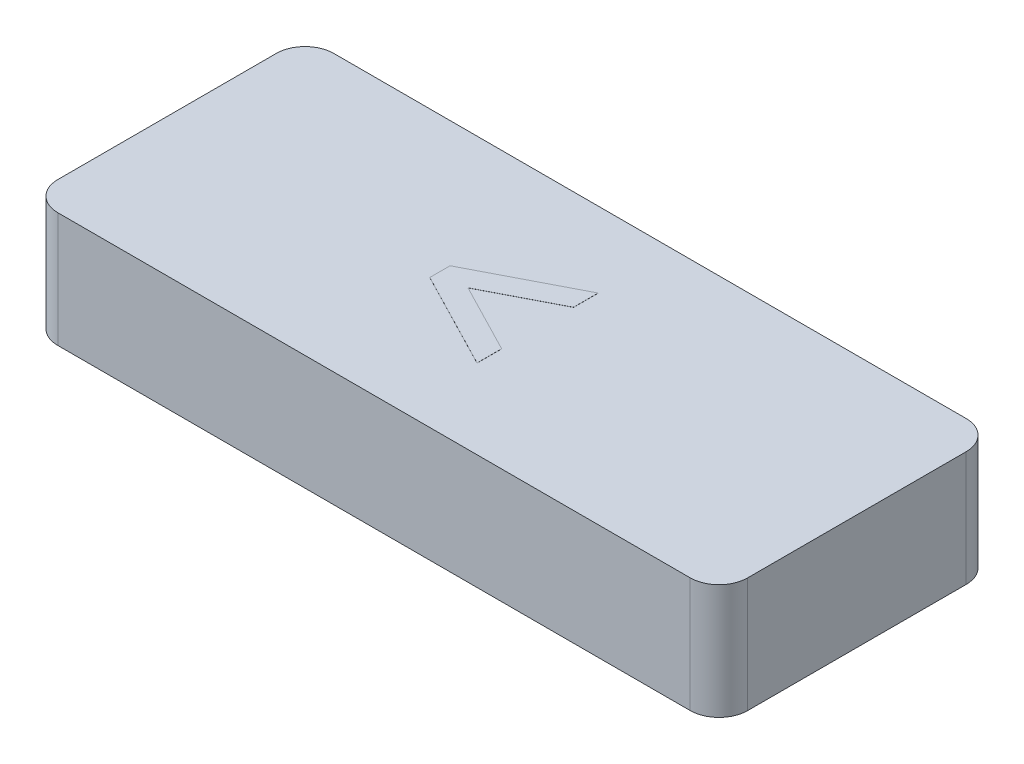
ISO-10303-21;
HEADER;
FILE_DESCRIPTION(('STEP AP214'),'2;1');
FILE_NAME('part.step','',(''),(''),'','','');
FILE_SCHEMA(('AUTOMOTIVE_DESIGN { 1 0 10303 214 1 1 1 1 }'));
ENDSEC;
DATA;
#1=APPLICATION_CONTEXT('core data for automotive mechanical design processes');
#2=APPLICATION_PROTOCOL_DEFINITION('international standard','automotive_design',2000,#1);
#3=PRODUCT_CONTEXT('',#1,'mechanical');
#4=PRODUCT('Part','Part','',(#3));
#5=PRODUCT_RELATED_PRODUCT_CATEGORY('part','',(#4));
#6=PRODUCT_DEFINITION_FORMATION('','',#4);
#7=PRODUCT_DEFINITION_CONTEXT('part definition',#1,'design');
#8=PRODUCT_DEFINITION('design','',#6,#7);
#9=PRODUCT_DEFINITION_SHAPE('','',#8);
#10=(LENGTH_UNIT() NAMED_UNIT(*) SI_UNIT(.MILLI.,.METRE.));
#11=(NAMED_UNIT(*) PLANE_ANGLE_UNIT() SI_UNIT($,.RADIAN.));
#12=(NAMED_UNIT(*) SI_UNIT($,.STERADIAN.) SOLID_ANGLE_UNIT());
#13=UNCERTAINTY_MEASURE_WITH_UNIT(LENGTH_MEASURE(1.E-05),#10,'distance_accuracy_value','');
#14=(GEOMETRIC_REPRESENTATION_CONTEXT(3) GLOBAL_UNCERTAINTY_ASSIGNED_CONTEXT((#13)) GLOBAL_UNIT_ASSIGNED_CONTEXT((#10,
#11,#12)) REPRESENTATION_CONTEXT('',''));
#15=CARTESIAN_POINT('',(0.,0.,0.));
#16=DIRECTION('',(0.,0.,1.));
#17=DIRECTION('',(1.,0.,0.));
#18=AXIS2_PLACEMENT_3D('',#15,#16,#17);
#19=CARTESIAN_POINT('',(0.,2.54,0.));
#20=DIRECTION('',(-1.,0.,0.));
#21=DIRECTION('',(0.,0.,1.));
#22=AXIS2_PLACEMENT_3D('',#19,#20,#21);
#23=PLANE('',#22);
#24=DIRECTION('',(0.,0.,-1.));
#25=VECTOR('',#24,1.);
#26=CARTESIAN_POINT('',(0.,2.54,0.));
#27=LINE('',#26,#25);
#28=CARTESIAN_POINT('',(0.,2.54,-0.635000000000001));
#29=VERTEX_POINT('',#28);
#30=CARTESIAN_POINT('',(0.,2.54,-5.461));
#31=VERTEX_POINT('',#30);
#32=EDGE_CURVE('E272',#29,#31,#27,.T.);
#33=ORIENTED_EDGE('',*,*,#32,.T.);
#34=DIRECTION('',(0.,-1.,0.));
#35=VECTOR('',#34,1.);
#36=CARTESIAN_POINT('',(0.,2.54,-5.461));
#37=LINE('',#36,#35);
#38=CARTESIAN_POINT('',(0.,0.,-5.461));
#39=VERTEX_POINT('',#38);
#40=EDGE_CURVE('E11',#31,#39,#37,.T.);
#41=ORIENTED_EDGE('',*,*,#40,.T.);
#42=DIRECTION('',(0.,0.,-1.));
#43=VECTOR('',#42,1.);
#44=CARTESIAN_POINT('',(0.,0.,0.));
#45=LINE('',#44,#43);
#46=CARTESIAN_POINT('',(0.,0.,-0.635000000000001));
#47=VERTEX_POINT('',#46);
#48=EDGE_CURVE('E242',#47,#39,#45,.T.);
#49=ORIENTED_EDGE('',*,*,#48,.F.);
#50=DIRECTION('',(0.,-1.,0.));
#51=VECTOR('',#50,1.);
#52=CARTESIAN_POINT('',(0.,2.54,-0.635000000000001));
#53=LINE('',#52,#51);
#54=EDGE_CURVE('E43',#47,#29,#53,.F.);
#55=ORIENTED_EDGE('',*,*,#54,.T.);
#56=EDGE_LOOP('',(#33,#41,#49,#55));
#57=FACE_BOUND('',#56,.T.);
#58=ADVANCED_FACE('F35',(#57),#23,.T.);
#59=CARTESIAN_POINT('',(15.24,2.54,0.));
#60=DIRECTION('',(0.,0.,1.));
#61=DIRECTION('',(1.,0.,0.));
#62=AXIS2_PLACEMENT_3D('',#59,#60,#61);
#63=PLANE('',#62);
#64=DIRECTION('',(-1.,0.,0.));
#65=VECTOR('',#64,1.);
#66=CARTESIAN_POINT('',(15.24,0.,0.));
#67=LINE('',#66,#65);
#68=CARTESIAN_POINT('',(14.605,0.,0.));
#69=VERTEX_POINT('',#68);
#70=CARTESIAN_POINT('',(0.635,0.,0.));
#71=VERTEX_POINT('',#70);
#72=EDGE_CURVE('E276',#69,#71,#67,.T.);
#73=ORIENTED_EDGE('',*,*,#72,.F.);
#74=DIRECTION('',(0.,-1.,0.));
#75=VECTOR('',#74,1.);
#76=CARTESIAN_POINT('',(14.605,2.54,0.));
#77=LINE('',#76,#75);
#78=CARTESIAN_POINT('',(14.605,2.54,0.));
#79=VERTEX_POINT('',#78);
#80=EDGE_CURVE('E322',#69,#79,#77,.F.);
#81=ORIENTED_EDGE('',*,*,#80,.T.);
#82=DIRECTION('',(-1.,0.,0.));
#83=VECTOR('',#82,1.);
#84=CARTESIAN_POINT('',(15.24,2.54,0.));
#85=LINE('',#84,#83);
#86=CARTESIAN_POINT('',(0.635,2.54,0.));
#87=VERTEX_POINT('',#86);
#88=EDGE_CURVE('E282',#79,#87,#85,.T.);
#89=ORIENTED_EDGE('',*,*,#88,.T.);
#90=DIRECTION('',(0.,-1.,0.));
#91=VECTOR('',#90,1.);
#92=CARTESIAN_POINT('',(0.635,2.54,0.));
#93=LINE('',#92,#91);
#94=EDGE_CURVE('E319',#87,#71,#93,.T.);
#95=ORIENTED_EDGE('',*,*,#94,.T.);
#96=EDGE_LOOP('',(#73,#81,#89,#95));
#97=FACE_BOUND('',#96,.T.);
#98=ADVANCED_FACE('F335',(#97),#63,.T.);
#99=CARTESIAN_POINT('',(15.24,2.54,-6.096));
#100=DIRECTION('',(1.,0.,0.));
#101=DIRECTION('',(0.,0.,-1.));
#102=AXIS2_PLACEMENT_3D('',#99,#100,#101);
#103=PLANE('',#102);
#104=DIRECTION('',(0.,0.,1.));
#105=VECTOR('',#104,1.);
#106=CARTESIAN_POINT('',(15.24,0.,-6.096));
#107=LINE('',#106,#105);
#108=CARTESIAN_POINT('',(15.24,0.,-5.461));
#109=VERTEX_POINT('',#108);
#110=CARTESIAN_POINT('',(15.24,0.,-0.634999999999998));
#111=VERTEX_POINT('',#110);
#112=EDGE_CURVE('E290',#109,#111,#107,.T.);
#113=ORIENTED_EDGE('',*,*,#112,.F.);
#114=DIRECTION('',(0.,-1.,0.));
#115=VECTOR('',#114,1.);
#116=CARTESIAN_POINT('',(15.24,2.54,-5.461));
#117=LINE('',#116,#115);
#118=CARTESIAN_POINT('',(15.24,2.54,-5.461));
#119=VERTEX_POINT('',#118);
#120=EDGE_CURVE('E310',#109,#119,#117,.F.);
#121=ORIENTED_EDGE('',*,*,#120,.T.);
#122=DIRECTION('',(0.,0.,1.));
#123=VECTOR('',#122,1.);
#124=CARTESIAN_POINT('',(15.24,2.54,-6.096));
#125=LINE('',#124,#123);
#126=CARTESIAN_POINT('',(15.24,2.54,-0.634999999999998));
#127=VERTEX_POINT('',#126);
#128=EDGE_CURVE('E279',#119,#127,#125,.T.);
#129=ORIENTED_EDGE('',*,*,#128,.T.);
#130=DIRECTION('',(0.,-1.,0.));
#131=VECTOR('',#130,1.);
#132=CARTESIAN_POINT('',(15.24,2.54,-0.634999999999998));
#133=LINE('',#132,#131);
#134=EDGE_CURVE('E307',#127,#111,#133,.T.);
#135=ORIENTED_EDGE('',*,*,#134,.T.);
#136=EDGE_LOOP('',(#113,#121,#129,#135));
#137=FACE_BOUND('',#136,.T.);
#138=ADVANCED_FACE('F345',(#137),#103,.T.);
#139=CARTESIAN_POINT('',(0.,2.54,-6.096));
#140=DIRECTION('',(0.,0.,-1.));
#141=DIRECTION('',(-1.,0.,0.));
#142=AXIS2_PLACEMENT_3D('',#139,#140,#141);
#143=PLANE('',#142);
#144=DIRECTION('',(1.,0.,0.));
#145=VECTOR('',#144,1.);
#146=CARTESIAN_POINT('',(0.,2.54,-6.096));
#147=LINE('',#146,#145);
#148=CARTESIAN_POINT('',(0.635000000000006,2.54,-6.096));
#149=VERTEX_POINT('',#148);
#150=CARTESIAN_POINT('',(14.605,2.54,-6.096));
#151=VERTEX_POINT('',#150);
#152=EDGE_CURVE('E275',#149,#151,#147,.T.);
#153=ORIENTED_EDGE('',*,*,#152,.T.);
#154=DIRECTION('',(0.,-1.,0.));
#155=VECTOR('',#154,1.);
#156=CARTESIAN_POINT('',(14.605,2.54,-6.096));
#157=LINE('',#156,#155);
#158=CARTESIAN_POINT('',(14.605,0.,-6.096));
#159=VERTEX_POINT('',#158);
#160=EDGE_CURVE('E296',#151,#159,#157,.T.);
#161=ORIENTED_EDGE('',*,*,#160,.T.);
#162=DIRECTION('',(1.,0.,0.));
#163=VECTOR('',#162,1.);
#164=CARTESIAN_POINT('',(0.,0.,-6.096));
#165=LINE('',#164,#163);
#166=CARTESIAN_POINT('',(0.635000000000006,0.,-6.096));
#167=VERTEX_POINT('',#166);
#168=EDGE_CURVE('E287',#167,#159,#165,.T.);
#169=ORIENTED_EDGE('',*,*,#168,.F.);
#170=DIRECTION('',(0.,-1.,0.));
#171=VECTOR('',#170,1.);
#172=CARTESIAN_POINT('',(0.635000000000006,2.54,-6.096));
#173=LINE('',#172,#171);
#174=EDGE_CURVE('E284',#167,#149,#173,.F.);
#175=ORIENTED_EDGE('',*,*,#174,.T.);
#176=EDGE_LOOP('',(#153,#161,#169,#175));
#177=FACE_BOUND('',#176,.T.);
#178=ADVANCED_FACE('F353',(#177),#143,.T.);
#179=CARTESIAN_POINT('',(0.,2.54,0.));
#180=DIRECTION('',(0.,-1.,0.));
#181=DIRECTION('',(0.,0.,-1.));
#182=AXIS2_PLACEMENT_3D('',#179,#180,#181);
#183=PLANE('',#182);
#184=DIRECTION('',(-0.888620657054864,0.,0.458642919770252));
#185=VECTOR('',#184,1.);
#186=CARTESIAN_POINT('',(8.14200256410257,2.54,-3.88489743589744));
#187=LINE('',#186,#185);
#188=CARTESIAN_POINT('',(8.14200256410257,2.54,-3.88489743589744));
#189=VERTEX_POINT('',#188);
#190=CARTESIAN_POINT('',(6.60411193910257,2.54,-3.09114743589744));
#191=VERTEX_POINT('',#190);
#192=EDGE_CURVE('E194',#189,#191,#187,.T.);
#193=ORIENTED_EDGE('',*,*,#192,.T.);
#194=DIRECTION('',(0.888620657054864,0.,0.458642919770252));
#195=VECTOR('',#194,1.);
#196=CARTESIAN_POINT('',(6.60411193910257,2.54,-3.09114743589744));
#197=LINE('',#196,#195);
#198=CARTESIAN_POINT('',(8.14200256410257,2.54,-2.29739743589744));
#199=VERTEX_POINT('',#198);
#200=EDGE_CURVE('E211',#191,#199,#197,.T.);
#201=ORIENTED_EDGE('',*,*,#200,.T.);
#202=DIRECTION('',(0.,0.,1.));
#203=VECTOR('',#202,1.);
#204=CARTESIAN_POINT('',(8.14200256410257,2.54,-2.29739743589744));
#205=LINE('',#204,#203);
#206=CARTESIAN_POINT('',(8.14200256410257,2.54,-1.75360236378205));
#207=VERTEX_POINT('',#206);
#208=EDGE_CURVE('E173',#199,#207,#205,.T.);
#209=ORIENTED_EDGE('',*,*,#208,.T.);
#210=DIRECTION('',(-0.888589658192358,0.,-0.458702975086916));
#211=VECTOR('',#210,1.);
#212=CARTESIAN_POINT('',(8.14200256410257,2.54,-1.75360236378205));
#213=LINE('',#212,#211);
#214=CARTESIAN_POINT('',(5.98463076923077,2.54,-2.86726923076923));
#215=VERTEX_POINT('',#214);
#216=EDGE_CURVE('E50',#207,#215,#213,.T.);
#217=ORIENTED_EDGE('',*,*,#216,.T.);
#218=DIRECTION('',(0.,0.,-1.));
#219=VECTOR('',#218,1.);
#220=CARTESIAN_POINT('',(5.98463076923077,2.54,-2.86726923076923));
#221=LINE('',#220,#219);
#222=CARTESIAN_POINT('',(5.98463076923077,2.54,-3.31566165865385));
#223=VERTEX_POINT('',#222);
#224=EDGE_CURVE('E215',#215,#223,#221,.T.);
#225=ORIENTED_EDGE('',*,*,#224,.T.);
#226=DIRECTION('',(0.888589658192358,0.,-0.458702975086916));
#227=VECTOR('',#226,1.);
#228=CARTESIAN_POINT('',(5.98463076923077,2.54,-3.31566165865385));
#229=LINE('',#228,#227);
#230=CARTESIAN_POINT('',(8.14200256410257,2.54,-4.42932852564102));
#231=VERTEX_POINT('',#230);
#232=EDGE_CURVE('E218',#223,#231,#229,.T.);
#233=ORIENTED_EDGE('',*,*,#232,.T.);
#234=DIRECTION('',(0.,0.,1.));
#235=VECTOR('',#234,1.);
#236=CARTESIAN_POINT('',(8.14200256410257,2.54,-4.42932852564102));
#237=LINE('',#236,#235);
#238=EDGE_CURVE('E197',#231,#189,#237,.T.);
#239=ORIENTED_EDGE('',*,*,#238,.T.);
#240=EDGE_LOOP('',(#193,#201,#209,#217,#225,#233,#239));
#241=FACE_BOUND('',#240,.T.);
#242=ORIENTED_EDGE('',*,*,#128,.F.);
#243=CARTESIAN_POINT('',(14.605,2.54,-5.461));
#244=DIRECTION('',(0.,-1.,0.));
#245=DIRECTION('',(0.,0.,-1.));
#246=AXIS2_PLACEMENT_3D('',#243,#244,#245);
#247=CIRCLE('',#246,0.635);
#248=EDGE_CURVE('E317',#119,#151,#247,.F.);
#249=ORIENTED_EDGE('',*,*,#248,.T.);
#250=ORIENTED_EDGE('',*,*,#152,.F.);
#251=CARTESIAN_POINT('',(0.635000000000006,2.54,-5.461));
#252=DIRECTION('',(0.,-1.,0.));
#253=DIRECTION('',(0.,0.,-1.));
#254=AXIS2_PLACEMENT_3D('',#251,#252,#253);
#255=CIRCLE('',#254,0.635);
#256=EDGE_CURVE('E313',#149,#31,#255,.F.);
#257=ORIENTED_EDGE('',*,*,#256,.T.);
#258=ORIENTED_EDGE('',*,*,#32,.F.);
#259=CARTESIAN_POINT('',(0.635,2.54,-0.635));
#260=DIRECTION('',(0.,-1.,0.));
#261=DIRECTION('',(0.,0.,-1.));
#262=AXIS2_PLACEMENT_3D('',#259,#260,#261);
#263=CIRCLE('',#262,0.635);
#264=EDGE_CURVE('E58',#29,#87,#263,.F.);
#265=ORIENTED_EDGE('',*,*,#264,.T.);
#266=ORIENTED_EDGE('',*,*,#88,.F.);
#267=CARTESIAN_POINT('',(14.605,2.54,-0.635));
#268=DIRECTION('',(0.,-1.,0.));
#269=DIRECTION('',(0.,0.,-1.));
#270=AXIS2_PLACEMENT_3D('',#267,#268,#269);
#271=CIRCLE('',#270,0.635);
#272=EDGE_CURVE('E315',#79,#127,#271,.F.);
#273=ORIENTED_EDGE('',*,*,#272,.T.);
#274=EDGE_LOOP('',(#242,#249,#250,#257,#258,#265,#266,#273));
#275=FACE_BOUND('',#274,.T.);
#276=ADVANCED_FACE('F329',(#241,#275),#183,.F.);
#277=CARTESIAN_POINT('',(0.,0.,0.));
#278=DIRECTION('',(0.,-1.,0.));
#279=DIRECTION('',(0.,0.,-1.));
#280=AXIS2_PLACEMENT_3D('',#277,#278,#279);
#281=PLANE('',#280);
#282=DIRECTION('',(0.,0.,-1.));
#283=VECTOR('',#282,1.);
#284=CARTESIAN_POINT('',(0.635,0.,0.));
#285=LINE('',#284,#283);
#286=CARTESIAN_POINT('',(0.635000000000001,0.,-0.635));
#287=VERTEX_POINT('',#286);
#288=CARTESIAN_POINT('',(0.635000000000006,0.,-5.461));
#289=VERTEX_POINT('',#288);
#290=EDGE_CURVE('E239',#287,#289,#285,.T.);
#291=ORIENTED_EDGE('',*,*,#290,.F.);
#292=DIRECTION('',(-1.,0.,0.));
#293=VECTOR('',#292,1.);
#294=CARTESIAN_POINT('',(0.,0.,-0.635));
#295=LINE('',#294,#293);
#296=CARTESIAN_POINT('',(14.605,0.,-0.635));
#297=VERTEX_POINT('',#296);
#298=EDGE_CURVE('E248',#297,#287,#295,.T.);
#299=ORIENTED_EDGE('',*,*,#298,.F.);
#300=DIRECTION('',(0.,0.,1.));
#301=VECTOR('',#300,1.);
#302=CARTESIAN_POINT('',(14.605,0.,0.));
#303=LINE('',#302,#301);
#304=CARTESIAN_POINT('',(14.605,0.,-5.461));
#305=VERTEX_POINT('',#304);
#306=EDGE_CURVE('E268',#305,#297,#303,.T.);
#307=ORIENTED_EDGE('',*,*,#306,.F.);
#308=DIRECTION('',(1.,0.,0.));
#309=VECTOR('',#308,1.);
#310=CARTESIAN_POINT('',(0.,0.,-5.461));
#311=LINE('',#310,#309);
#312=EDGE_CURVE('E265',#289,#305,#311,.T.);
#313=ORIENTED_EDGE('',*,*,#312,.F.);
#314=EDGE_LOOP('',(#291,#299,#307,#313));
#315=FACE_BOUND('',#314,.T.);
#316=ORIENTED_EDGE('',*,*,#168,.T.);
#317=CARTESIAN_POINT('',(14.605,0.,-5.461));
#318=DIRECTION('',(0.,-1.,0.));
#319=DIRECTION('',(0.,0.,-1.));
#320=AXIS2_PLACEMENT_3D('',#317,#318,#319);
#321=CIRCLE('',#320,0.635);
#322=EDGE_CURVE('E305',#159,#109,#321,.T.);
#323=ORIENTED_EDGE('',*,*,#322,.T.);
#324=ORIENTED_EDGE('',*,*,#112,.T.);
#325=CARTESIAN_POINT('',(14.605,0.,-0.635));
#326=DIRECTION('',(0.,-1.,0.));
#327=DIRECTION('',(0.,0.,-1.));
#328=AXIS2_PLACEMENT_3D('',#325,#326,#327);
#329=CIRCLE('',#328,0.635);
#330=EDGE_CURVE('E303',#111,#69,#329,.T.);
#331=ORIENTED_EDGE('',*,*,#330,.T.);
#332=ORIENTED_EDGE('',*,*,#72,.T.);
#333=CARTESIAN_POINT('',(0.635,0.,-0.635));
#334=DIRECTION('',(0.,-1.,0.));
#335=DIRECTION('',(0.,0.,-1.));
#336=AXIS2_PLACEMENT_3D('',#333,#334,#335);
#337=CIRCLE('',#336,0.635);
#338=EDGE_CURVE('E299',#71,#47,#337,.T.);
#339=ORIENTED_EDGE('',*,*,#338,.T.);
#340=ORIENTED_EDGE('',*,*,#48,.T.);
#341=CARTESIAN_POINT('',(0.635000000000006,0.,-5.461));
#342=DIRECTION('',(0.,-1.,0.));
#343=DIRECTION('',(0.,0.,-1.));
#344=AXIS2_PLACEMENT_3D('',#341,#342,#343);
#345=CIRCLE('',#344,0.635);
#346=EDGE_CURVE('E301',#39,#167,#345,.T.);
#347=ORIENTED_EDGE('',*,*,#346,.T.);
#348=EDGE_LOOP('',(#316,#323,#324,#331,#332,#339,#340,#347));
#349=FACE_BOUND('',#348,.T.);
#350=ADVANCED_FACE('F338',(#315,#349),#281,.T.);
#351=CARTESIAN_POINT('',(0.635,2.54,0.));
#352=DIRECTION('',(-1.,0.,0.));
#353=DIRECTION('',(0.,0.,1.));
#354=AXIS2_PLACEMENT_3D('',#351,#352,#353);
#355=PLANE('',#354);
#356=ORIENTED_EDGE('',*,*,#290,.T.);
#357=DIRECTION('',(0.,-1.,0.));
#358=VECTOR('',#357,1.);
#359=CARTESIAN_POINT('',(0.635000000000006,2.54,-5.461));
#360=LINE('',#359,#358);
#361=CARTESIAN_POINT('',(0.635000000000006,1.905,-5.461));
#362=VERTEX_POINT('',#361);
#363=EDGE_CURVE('E249',#362,#289,#360,.T.);
#364=ORIENTED_EDGE('',*,*,#363,.F.);
#365=DIRECTION('',(0.,0.,-1.));
#366=VECTOR('',#365,1.);
#367=CARTESIAN_POINT('',(0.635,1.905,0.));
#368=LINE('',#367,#366);
#369=CARTESIAN_POINT('',(0.635000000000001,1.905,-0.635));
#370=VERTEX_POINT('',#369);
#371=EDGE_CURVE('E244',#370,#362,#368,.T.);
#372=ORIENTED_EDGE('',*,*,#371,.F.);
#373=DIRECTION('',(0.,-1.,0.));
#374=VECTOR('',#373,1.);
#375=CARTESIAN_POINT('',(0.635,2.54,-0.635));
#376=LINE('',#375,#374);
#377=EDGE_CURVE('E240',#370,#287,#376,.T.);
#378=ORIENTED_EDGE('',*,*,#377,.T.);
#379=EDGE_LOOP('',(#356,#364,#372,#378));
#380=FACE_BOUND('',#379,.T.);
#381=ADVANCED_FACE('F395',(#380),#355,.F.);
#382=CARTESIAN_POINT('',(15.24,2.54,-0.635));
#383=DIRECTION('',(0.,0.,1.));
#384=DIRECTION('',(1.,0.,0.));
#385=AXIS2_PLACEMENT_3D('',#382,#383,#384);
#386=PLANE('',#385);
#387=ORIENTED_EDGE('',*,*,#298,.T.);
#388=ORIENTED_EDGE('',*,*,#377,.F.);
#389=DIRECTION('',(-1.,0.,0.));
#390=VECTOR('',#389,1.);
#391=CARTESIAN_POINT('',(0.,1.905,-0.635));
#392=LINE('',#391,#390);
#393=CARTESIAN_POINT('',(14.605,1.905,-0.635));
#394=VERTEX_POINT('',#393);
#395=EDGE_CURVE('E252',#394,#370,#392,.T.);
#396=ORIENTED_EDGE('',*,*,#395,.F.);
#397=DIRECTION('',(0.,-1.,0.));
#398=VECTOR('',#397,1.);
#399=CARTESIAN_POINT('',(14.605,2.54,-0.635));
#400=LINE('',#399,#398);
#401=EDGE_CURVE('E243',#394,#297,#400,.T.);
#402=ORIENTED_EDGE('',*,*,#401,.T.);
#403=EDGE_LOOP('',(#387,#388,#396,#402));
#404=FACE_BOUND('',#403,.T.);
#405=ADVANCED_FACE('F421',(#404),#386,.F.);
#406=CARTESIAN_POINT('',(14.605,2.54,-6.096));
#407=DIRECTION('',(1.,0.,0.));
#408=DIRECTION('',(0.,0.,-1.));
#409=AXIS2_PLACEMENT_3D('',#406,#407,#408);
#410=PLANE('',#409);
#411=ORIENTED_EDGE('',*,*,#306,.T.);
#412=ORIENTED_EDGE('',*,*,#401,.F.);
#413=DIRECTION('',(0.,0.,1.));
#414=VECTOR('',#413,1.);
#415=CARTESIAN_POINT('',(14.605,1.905,0.));
#416=LINE('',#415,#414);
#417=CARTESIAN_POINT('',(14.605,1.905,-5.461));
#418=VERTEX_POINT('',#417);
#419=EDGE_CURVE('E257',#418,#394,#416,.T.);
#420=ORIENTED_EDGE('',*,*,#419,.F.);
#421=DIRECTION('',(0.,-1.,0.));
#422=VECTOR('',#421,1.);
#423=CARTESIAN_POINT('',(14.605,2.54,-5.461));
#424=LINE('',#423,#422);
#425=EDGE_CURVE('E251',#418,#305,#424,.T.);
#426=ORIENTED_EDGE('',*,*,#425,.T.);
#427=EDGE_LOOP('',(#411,#412,#420,#426));
#428=FACE_BOUND('',#427,.T.);
#429=ADVANCED_FACE('F384',(#428),#410,.F.);
#430=CARTESIAN_POINT('',(0.,2.54,-5.461));
#431=DIRECTION('',(0.,0.,-1.));
#432=DIRECTION('',(-1.,0.,0.));
#433=AXIS2_PLACEMENT_3D('',#430,#431,#432);
#434=PLANE('',#433);
#435=ORIENTED_EDGE('',*,*,#312,.T.);
#436=ORIENTED_EDGE('',*,*,#425,.F.);
#437=DIRECTION('',(1.,0.,0.));
#438=VECTOR('',#437,1.);
#439=CARTESIAN_POINT('',(0.,1.905,-5.461));
#440=LINE('',#439,#438);
#441=EDGE_CURVE('E247',#362,#418,#440,.T.);
#442=ORIENTED_EDGE('',*,*,#441,.F.);
#443=ORIENTED_EDGE('',*,*,#363,.T.);
#444=EDGE_LOOP('',(#435,#436,#442,#443));
#445=FACE_BOUND('',#444,.T.);
#446=ADVANCED_FACE('F378',(#445),#434,.F.);
#447=CARTESIAN_POINT('',(0.,1.905,0.));
#448=DIRECTION('',(0.,-1.,0.));
#449=DIRECTION('',(0.,0.,-1.));
#450=AXIS2_PLACEMENT_3D('',#447,#448,#449);
#451=PLANE('',#450);
#452=CARTESIAN_POINT('',(7.62,1.905,-3.048));
#453=DIRECTION('',(0.,-1.,0.));
#454=DIRECTION('',(0.,0.,-1.));
#455=AXIS2_PLACEMENT_3D('',#452,#453,#454);
#456=CIRCLE('',#455,1.5875);
#457=CARTESIAN_POINT('',(7.62,1.905,-4.6355));
#458=VERTEX_POINT('',#457);
#459=EDGE_CURVE('E224',#458,#458,#456,.T.);
#460=ORIENTED_EDGE('',*,*,#459,.F.);
#461=EDGE_LOOP('',(#460));
#462=FACE_BOUND('',#461,.T.);
#463=ORIENTED_EDGE('',*,*,#371,.T.);
#464=ORIENTED_EDGE('',*,*,#441,.T.);
#465=ORIENTED_EDGE('',*,*,#419,.T.);
#466=ORIENTED_EDGE('',*,*,#395,.T.);
#467=EDGE_LOOP('',(#463,#464,#465,#466));
#468=FACE_BOUND('',#467,.T.);
#469=ADVANCED_FACE('F374',(#462,#468),#451,.T.);
#470=CARTESIAN_POINT('',(14.605,2.54,-5.461));
#471=DIRECTION('',(0.,-1.,0.));
#472=DIRECTION('',(0.,0.,-1.));
#473=AXIS2_PLACEMENT_3D('',#470,#471,#472);
#474=CYLINDRICAL_SURFACE('',#473,0.635);
#475=ORIENTED_EDGE('',*,*,#248,.F.);
#476=ORIENTED_EDGE('',*,*,#120,.F.);
#477=ORIENTED_EDGE('',*,*,#322,.F.);
#478=ORIENTED_EDGE('',*,*,#160,.F.);
#479=EDGE_LOOP('',(#475,#476,#477,#478));
#480=FACE_BOUND('',#479,.T.);
#481=ADVANCED_FACE('F350',(#480),#474,.T.);
#482=CARTESIAN_POINT('',(14.605,2.54,-0.635));
#483=DIRECTION('',(0.,-1.,0.));
#484=DIRECTION('',(0.,0.,-1.));
#485=AXIS2_PLACEMENT_3D('',#482,#483,#484);
#486=CYLINDRICAL_SURFACE('',#485,0.635);
#487=ORIENTED_EDGE('',*,*,#272,.F.);
#488=ORIENTED_EDGE('',*,*,#80,.F.);
#489=ORIENTED_EDGE('',*,*,#330,.F.);
#490=ORIENTED_EDGE('',*,*,#134,.F.);
#491=EDGE_LOOP('',(#487,#488,#489,#490));
#492=FACE_BOUND('',#491,.T.);
#493=ADVANCED_FACE('F343',(#492),#486,.T.);
#494=CARTESIAN_POINT('',(0.635000000000006,2.54,-5.461));
#495=DIRECTION('',(0.,-1.,0.));
#496=DIRECTION('',(0.,0.,-1.));
#497=AXIS2_PLACEMENT_3D('',#494,#495,#496);
#498=CYLINDRICAL_SURFACE('',#497,0.635);
#499=ORIENTED_EDGE('',*,*,#256,.F.);
#500=ORIENTED_EDGE('',*,*,#174,.F.);
#501=ORIENTED_EDGE('',*,*,#346,.F.);
#502=ORIENTED_EDGE('',*,*,#40,.F.);
#503=EDGE_LOOP('',(#499,#500,#501,#502));
#504=FACE_BOUND('',#503,.T.);
#505=ADVANCED_FACE('F356',(#504),#498,.T.);
#506=CARTESIAN_POINT('',(0.635,2.54,-0.635));
#507=DIRECTION('',(0.,-1.,0.));
#508=DIRECTION('',(0.,0.,-1.));
#509=AXIS2_PLACEMENT_3D('',#506,#507,#508);
#510=CYLINDRICAL_SURFACE('',#509,0.635);
#511=ORIENTED_EDGE('',*,*,#264,.F.);
#512=ORIENTED_EDGE('',*,*,#54,.F.);
#513=ORIENTED_EDGE('',*,*,#338,.F.);
#514=ORIENTED_EDGE('',*,*,#94,.F.);
#515=EDGE_LOOP('',(#511,#512,#513,#514));
#516=FACE_BOUND('',#515,.T.);
#517=ADVANCED_FACE('F37',(#516),#510,.T.);
#518=CARTESIAN_POINT('',(7.62,-4.49012806053458,-3.048));
#519=DIRECTION('',(0.,1.,0.));
#520=DIRECTION('',(0.,0.,1.));
#521=AXIS2_PLACEMENT_3D('',#518,#519,#520);
#522=CYLINDRICAL_SURFACE('',#521,1.5875);
#523=ORIENTED_EDGE('',*,*,#459,.T.);
#524=EDGE_LOOP('',(#523));
#525=FACE_BOUND('',#524,.T.);
#526=CARTESIAN_POINT('',(7.62,0.,-3.048));
#527=DIRECTION('',(0.,-1.,0.));
#528=DIRECTION('',(0.,0.,-1.));
#529=AXIS2_PLACEMENT_3D('',#526,#527,#528);
#530=CIRCLE('',#529,1.5875);
#531=CARTESIAN_POINT('',(7.62,0.,-4.6355));
#532=VERTEX_POINT('',#531);
#533=EDGE_CURVE('E236',#532,#532,#530,.T.);
#534=ORIENTED_EDGE('',*,*,#533,.F.);
#535=EDGE_LOOP('',(#534));
#536=FACE_BOUND('',#535,.T.);
#537=ADVANCED_FACE('F362',(#525,#536),#522,.T.);
#538=CARTESIAN_POINT('',(0.,0.,0.));
#539=DIRECTION('',(0.,-1.,0.));
#540=DIRECTION('',(0.,0.,-1.));
#541=AXIS2_PLACEMENT_3D('',#538,#539,#540);
#542=PLANE('',#541);
#543=ORIENTED_EDGE('',*,*,#533,.T.);
#544=EDGE_LOOP('',(#543));
#545=FACE_BOUND('',#544,.T.);
#546=ADVANCED_FACE('F490',(#545),#542,.T.);
#547=CARTESIAN_POINT('',(6.60411193910257,2.54254,-3.09114743589744));
#548=DIRECTION('',(0.458642919770252,0.,-0.888620657054864));
#549=DIRECTION('',(-0.888620657054864,0.,-0.458642919770252));
#550=AXIS2_PLACEMENT_3D('',#547,#548,#549);
#551=PLANE('',#550);
#552=ORIENTED_EDGE('',*,*,#200,.F.);
#553=DIRECTION('',(0.,-1.,0.));
#554=VECTOR('',#553,1.);
#555=CARTESIAN_POINT('',(6.60411193910257,2.54254,-3.09114743589744));
#556=LINE('',#555,#554);
#557=CARTESIAN_POINT('',(6.60411193910257,2.54254,-3.09114743589744));
#558=VERTEX_POINT('',#557);
#559=EDGE_CURVE('E193',#558,#191,#556,.T.);
#560=ORIENTED_EDGE('',*,*,#559,.F.);
#561=DIRECTION('',(0.888620657054864,0.,0.458642919770252));
#562=VECTOR('',#561,1.);
#563=CARTESIAN_POINT('',(6.60411193910257,2.54254,-3.09114743589744));
#564=LINE('',#563,#562);
#565=CARTESIAN_POINT('',(8.14200256410257,2.54254,-2.29739743589744));
#566=VERTEX_POINT('',#565);
#567=EDGE_CURVE('E186',#558,#566,#564,.T.);
#568=ORIENTED_EDGE('',*,*,#567,.T.);
#569=DIRECTION('',(0.,-1.,0.));
#570=VECTOR('',#569,1.);
#571=CARTESIAN_POINT('',(8.14200256410257,2.54254,-2.29739743589744));
#572=LINE('',#571,#570);
#573=EDGE_CURVE('E168',#566,#199,#572,.T.);
#574=ORIENTED_EDGE('',*,*,#573,.T.);
#575=EDGE_LOOP('',(#552,#560,#568,#574));
#576=FACE_BOUND('',#575,.T.);
#577=ADVANCED_FACE('F192',(#576),#551,.T.);
#578=CARTESIAN_POINT('',(8.14200256410257,2.54254,-3.88489743589744));
#579=DIRECTION('',(0.458642919770252,0.,0.888620657054864));
#580=DIRECTION('',(0.888620657054864,0.,-0.458642919770252));
#581=AXIS2_PLACEMENT_3D('',#578,#579,#580);
#582=PLANE('',#581);
#583=ORIENTED_EDGE('',*,*,#192,.F.);
#584=DIRECTION('',(0.,-1.,0.));
#585=VECTOR('',#584,1.);
#586=CARTESIAN_POINT('',(8.14200256410257,2.54254,-3.88489743589744));
#587=LINE('',#586,#585);
#588=CARTESIAN_POINT('',(8.14200256410257,2.54254,-3.88489743589744));
#589=VERTEX_POINT('',#588);
#590=EDGE_CURVE('E225',#589,#189,#587,.T.);
#591=ORIENTED_EDGE('',*,*,#590,.F.);
#592=DIRECTION('',(-0.888620657054864,0.,0.458642919770252));
#593=VECTOR('',#592,1.);
#594=CARTESIAN_POINT('',(8.14200256410257,2.54254,-3.88489743589744));
#595=LINE('',#594,#593);
#596=EDGE_CURVE('E179',#589,#558,#595,.T.);
#597=ORIENTED_EDGE('',*,*,#596,.T.);
#598=ORIENTED_EDGE('',*,*,#559,.T.);
#599=EDGE_LOOP('',(#583,#591,#597,#598));
#600=FACE_BOUND('',#599,.T.);
#601=ADVANCED_FACE('F505',(#600),#582,.T.);
#602=CARTESIAN_POINT('',(8.14200256410257,2.54254,-4.42932852564102));
#603=DIRECTION('',(1.,0.,0.));
#604=DIRECTION('',(0.,0.,-1.));
#605=AXIS2_PLACEMENT_3D('',#602,#603,#604);
#606=PLANE('',#605);
#607=ORIENTED_EDGE('',*,*,#238,.F.);
#608=DIRECTION('',(0.,-1.,0.));
#609=VECTOR('',#608,1.);
#610=CARTESIAN_POINT('',(8.14200256410257,2.54254,-4.42932852564102));
#611=LINE('',#610,#609);
#612=CARTESIAN_POINT('',(8.14200256410257,2.54254,-4.42932852564102));
#613=VERTEX_POINT('',#612);
#614=EDGE_CURVE('E227',#613,#231,#611,.T.);
#615=ORIENTED_EDGE('',*,*,#614,.F.);
#616=DIRECTION('',(0.,0.,1.));
#617=VECTOR('',#616,1.);
#618=CARTESIAN_POINT('',(8.14200256410257,2.54254,-4.42932852564102));
#619=LINE('',#618,#617);
#620=EDGE_CURVE('E207',#613,#589,#619,.T.);
#621=ORIENTED_EDGE('',*,*,#620,.T.);
#622=ORIENTED_EDGE('',*,*,#590,.T.);
#623=EDGE_LOOP('',(#607,#615,#621,#622));
#624=FACE_BOUND('',#623,.T.);
#625=ADVANCED_FACE('F513',(#624),#606,.T.);
#626=CARTESIAN_POINT('',(5.98463076923077,2.54254,-3.31566165865385));
#627=DIRECTION('',(-0.458702975086916,0.,-0.888589658192358));
#628=DIRECTION('',(-0.888589658192358,0.,0.458702975086916));
#629=AXIS2_PLACEMENT_3D('',#626,#627,#628);
#630=PLANE('',#629);
#631=ORIENTED_EDGE('',*,*,#232,.F.);
#632=DIRECTION('',(0.,-1.,0.));
#633=VECTOR('',#632,1.);
#634=CARTESIAN_POINT('',(5.98463076923077,2.54254,-3.31566165865385));
#635=LINE('',#634,#633);
#636=CARTESIAN_POINT('',(5.98463076923077,2.54254,-3.31566165865385));
#637=VERTEX_POINT('',#636);
#638=EDGE_CURVE('E229',#637,#223,#635,.T.);
#639=ORIENTED_EDGE('',*,*,#638,.F.);
#640=DIRECTION('',(0.888589658192358,0.,-0.458702975086916));
#641=VECTOR('',#640,1.);
#642=CARTESIAN_POINT('',(5.98463076923077,2.54254,-3.31566165865385));
#643=LINE('',#642,#641);
#644=EDGE_CURVE('E204',#637,#613,#643,.T.);
#645=ORIENTED_EDGE('',*,*,#644,.T.);
#646=ORIENTED_EDGE('',*,*,#614,.T.);
#647=EDGE_LOOP('',(#631,#639,#645,#646));
#648=FACE_BOUND('',#647,.T.);
#649=ADVANCED_FACE('F522',(#648),#630,.T.);
#650=CARTESIAN_POINT('',(5.98463076923077,2.54254,-2.86726923076923));
#651=DIRECTION('',(-1.,0.,0.));
#652=DIRECTION('',(0.,0.,1.));
#653=AXIS2_PLACEMENT_3D('',#650,#651,#652);
#654=PLANE('',#653);
#655=ORIENTED_EDGE('',*,*,#224,.F.);
#656=DIRECTION('',(0.,-1.,0.));
#657=VECTOR('',#656,1.);
#658=CARTESIAN_POINT('',(5.98463076923077,2.54254,-2.86726923076923));
#659=LINE('',#658,#657);
#660=CARTESIAN_POINT('',(5.98463076923077,2.54254,-2.86726923076923));
#661=VERTEX_POINT('',#660);
#662=EDGE_CURVE('E231',#661,#215,#659,.T.);
#663=ORIENTED_EDGE('',*,*,#662,.F.);
#664=DIRECTION('',(0.,0.,-1.));
#665=VECTOR('',#664,1.);
#666=CARTESIAN_POINT('',(5.98463076923077,2.54254,-2.86726923076923));
#667=LINE('',#666,#665);
#668=EDGE_CURVE('E201',#661,#637,#667,.T.);
#669=ORIENTED_EDGE('',*,*,#668,.T.);
#670=ORIENTED_EDGE('',*,*,#638,.T.);
#671=EDGE_LOOP('',(#655,#663,#669,#670));
#672=FACE_BOUND('',#671,.T.);
#673=ADVANCED_FACE('F531',(#672),#654,.T.);
#674=CARTESIAN_POINT('',(8.14200256410257,2.54254,-1.75360236378205));
#675=DIRECTION('',(-0.458702975086916,0.,0.888589658192358));
#676=DIRECTION('',(0.888589658192358,0.,0.458702975086916));
#677=AXIS2_PLACEMENT_3D('',#674,#675,#676);
#678=PLANE('',#677);
#679=ORIENTED_EDGE('',*,*,#216,.F.);
#680=DIRECTION('',(0.,-1.,0.));
#681=VECTOR('',#680,1.);
#682=CARTESIAN_POINT('',(8.14200256410257,2.54254,-1.75360236378205));
#683=LINE('',#682,#681);
#684=CARTESIAN_POINT('',(8.14200256410257,2.54254,-1.75360236378205));
#685=VERTEX_POINT('',#684);
#686=EDGE_CURVE('E178',#685,#207,#683,.T.);
#687=ORIENTED_EDGE('',*,*,#686,.F.);
#688=DIRECTION('',(-0.888589658192358,0.,-0.458702975086916));
#689=VECTOR('',#688,1.);
#690=CARTESIAN_POINT('',(8.14200256410257,2.54254,-1.75360236378205));
#691=LINE('',#690,#689);
#692=EDGE_CURVE('E190',#685,#661,#691,.T.);
#693=ORIENTED_EDGE('',*,*,#692,.T.);
#694=ORIENTED_EDGE('',*,*,#662,.T.);
#695=EDGE_LOOP('',(#679,#687,#693,#694));
#696=FACE_BOUND('',#695,.T.);
#697=ADVANCED_FACE('F540',(#696),#678,.T.);
#698=CARTESIAN_POINT('',(8.14200256410257,2.54254,-2.29739743589744));
#699=DIRECTION('',(1.,0.,0.));
#700=DIRECTION('',(0.,0.,-1.));
#701=AXIS2_PLACEMENT_3D('',#698,#699,#700);
#702=PLANE('',#701);
#703=ORIENTED_EDGE('',*,*,#208,.F.);
#704=ORIENTED_EDGE('',*,*,#573,.F.);
#705=DIRECTION('',(0.,0.,1.));
#706=VECTOR('',#705,1.);
#707=CARTESIAN_POINT('',(8.14200256410257,2.54254,-2.29739743589744));
#708=LINE('',#707,#706);
#709=EDGE_CURVE('E171',#566,#685,#708,.T.);
#710=ORIENTED_EDGE('',*,*,#709,.T.);
#711=ORIENTED_EDGE('',*,*,#686,.T.);
#712=EDGE_LOOP('',(#703,#704,#710,#711));
#713=FACE_BOUND('',#712,.T.);
#714=ADVANCED_FACE('F170',(#713),#702,.T.);
#715=CARTESIAN_POINT('',(0.,2.54254,0.));
#716=DIRECTION('',(0.,-1.,0.));
#717=DIRECTION('',(0.,0.,-1.));
#718=AXIS2_PLACEMENT_3D('',#715,#716,#717);
#719=PLANE('',#718);
#720=ORIENTED_EDGE('',*,*,#567,.F.);
#721=ORIENTED_EDGE('',*,*,#596,.F.);
#722=ORIENTED_EDGE('',*,*,#620,.F.);
#723=ORIENTED_EDGE('',*,*,#644,.F.);
#724=ORIENTED_EDGE('',*,*,#668,.F.);
#725=ORIENTED_EDGE('',*,*,#692,.F.);
#726=ORIENTED_EDGE('',*,*,#709,.F.);
#727=EDGE_LOOP('',(#720,#721,#722,#723,#724,#725,#726));
#728=FACE_BOUND('',#727,.T.);
#729=ADVANCED_FACE('F184',(#728),#719,.F.);
#730=CLOSED_SHELL('',(#58,#98,#138,#178,#276,#350,#381,#405,#429,#446,#469,#481,#493,#505,#517,
#537,#546,#577,#601,#625,#649,#673,#697,#714,#729));
#731=MANIFOLD_SOLID_BREP('B2',#730);
#732=ADVANCED_BREP_SHAPE_REPRESENTATION('',(#18,#731),#14);
#733=SHAPE_DEFINITION_REPRESENTATION(#9,#732);
ENDSEC;
END-ISO-10303-21;
